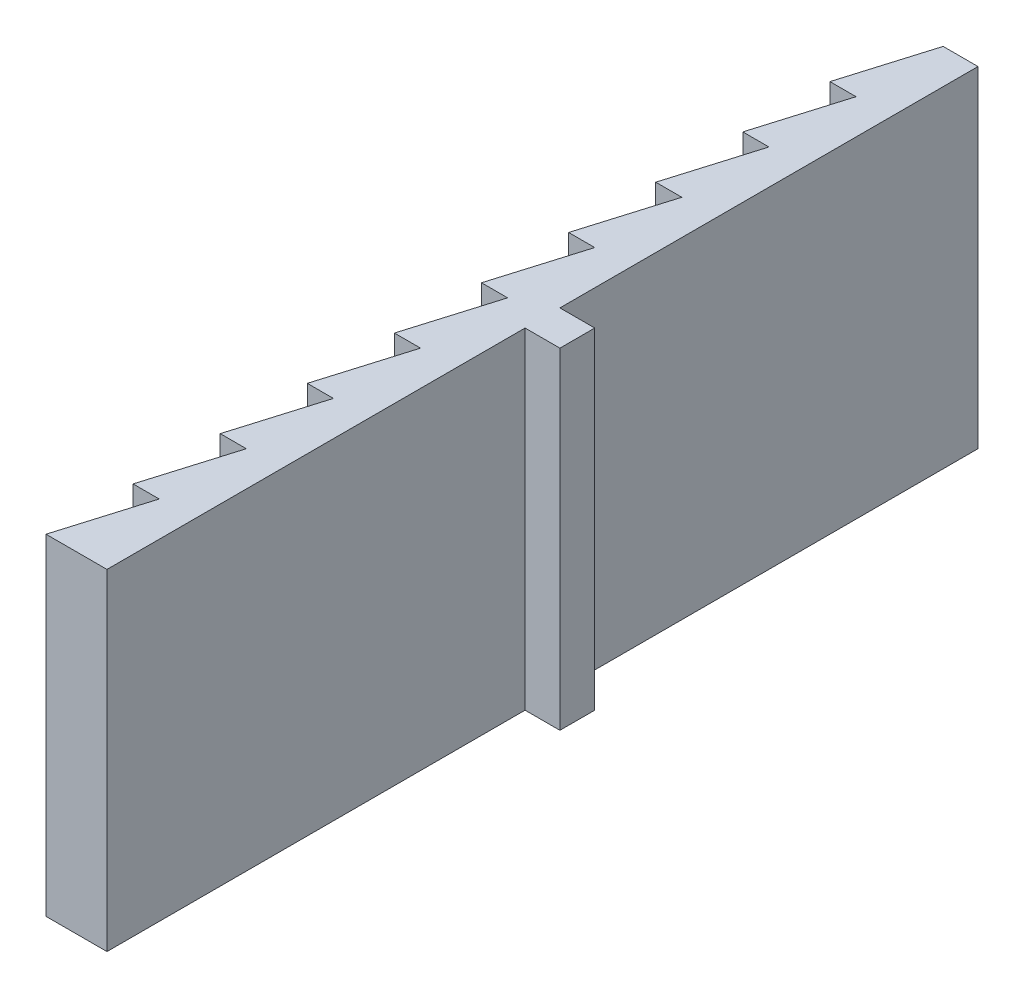
ISO-10303-21;
HEADER;
FILE_DESCRIPTION(('STEP AP214'),'2;1');
FILE_NAME('part.step','',(''),(''),'','','');
FILE_SCHEMA(('AUTOMOTIVE_DESIGN { 1 0 10303 214 1 1 1 1 }'));
ENDSEC;
DATA;
#1=APPLICATION_CONTEXT('core data for automotive mechanical design processes');
#2=APPLICATION_PROTOCOL_DEFINITION('international standard','automotive_design',2000,#1);
#3=PRODUCT_CONTEXT('',#1,'mechanical');
#4=PRODUCT('Part','Part','',(#3));
#5=PRODUCT_RELATED_PRODUCT_CATEGORY('part','',(#4));
#6=PRODUCT_DEFINITION_FORMATION('','',#4);
#7=PRODUCT_DEFINITION_CONTEXT('part definition',#1,'design');
#8=PRODUCT_DEFINITION('design','',#6,#7);
#9=PRODUCT_DEFINITION_SHAPE('','',#8);
#10=(LENGTH_UNIT() NAMED_UNIT(*) SI_UNIT(.MILLI.,.METRE.));
#11=(NAMED_UNIT(*) PLANE_ANGLE_UNIT() SI_UNIT($,.RADIAN.));
#12=(NAMED_UNIT(*) SI_UNIT($,.STERADIAN.) SOLID_ANGLE_UNIT());
#13=UNCERTAINTY_MEASURE_WITH_UNIT(LENGTH_MEASURE(1.E-05),#10,'distance_accuracy_value','');
#14=(GEOMETRIC_REPRESENTATION_CONTEXT(3) GLOBAL_UNCERTAINTY_ASSIGNED_CONTEXT((#13)) GLOBAL_UNIT_ASSIGNED_CONTEXT((#10,
#11,#12)) REPRESENTATION_CONTEXT('',''));
#15=CARTESIAN_POINT('',(0.,0.,0.));
#16=DIRECTION('',(0.,0.,1.));
#17=DIRECTION('',(1.,0.,0.));
#18=AXIS2_PLACEMENT_3D('',#15,#16,#17);
#19=CARTESIAN_POINT('',(0.,9.5,0.));
#20=DIRECTION('',(-1.,0.,0.));
#21=DIRECTION('',(0.,0.,1.));
#22=AXIS2_PLACEMENT_3D('',#19,#20,#21);
#23=PLANE('',#22);
#24=DIRECTION('',(0.,1.,0.));
#25=VECTOR('',#24,1.);
#26=CARTESIAN_POINT('',(0.,0.,-13.));
#27=LINE('',#26,#25);
#28=CARTESIAN_POINT('',(0.,0.,-13.));
#29=VERTEX_POINT('',#28);
#30=CARTESIAN_POINT('',(0.,9.5,-13.));
#31=VERTEX_POINT('',#30);
#32=EDGE_CURVE('E582',#29,#31,#27,.T.);
#33=ORIENTED_EDGE('',*,*,#32,.F.);
#34=DIRECTION('',(0.,0.,-1.));
#35=VECTOR('',#34,1.);
#36=CARTESIAN_POINT('',(0.,0.,0.));
#37=LINE('',#36,#35);
#38=CARTESIAN_POINT('',(0.,0.,-25.));
#39=VERTEX_POINT('',#38);
#40=EDGE_CURVE('E446',#29,#39,#37,.T.);
#41=ORIENTED_EDGE('',*,*,#40,.T.);
#42=DIRECTION('',(0.,-1.,0.));
#43=VECTOR('',#42,1.);
#44=CARTESIAN_POINT('',(0.,9.5,-25.));
#45=LINE('',#44,#43);
#46=CARTESIAN_POINT('',(0.,9.5,-25.));
#47=VERTEX_POINT('',#46);
#48=EDGE_CURVE('E560',#47,#39,#45,.T.);
#49=ORIENTED_EDGE('',*,*,#48,.F.);
#50=DIRECTION('',(0.,0.,-1.));
#51=VECTOR('',#50,1.);
#52=CARTESIAN_POINT('',(0.,9.5,0.));
#53=LINE('',#52,#51);
#54=EDGE_CURVE('E604',#31,#47,#53,.T.);
#55=ORIENTED_EDGE('',*,*,#54,.F.);
#56=EDGE_LOOP('',(#33,#41,#49,#55));
#57=FACE_BOUND('',#56,.T.);
#58=ADVANCED_FACE('F219',(#57),#23,.F.);
#59=CARTESIAN_POINT('',(0.,0.,0.));
#60=DIRECTION('',(0.,1.,0.));
#61=DIRECTION('',(0.,0.,1.));
#62=AXIS2_PLACEMENT_3D('',#59,#60,#61);
#63=PLANE('',#62);
#64=CARTESIAN_POINT('',(0.,0.,0.));
#65=VERTEX_POINT('',#64);
#66=CARTESIAN_POINT('',(0.,0.,-12.));
#67=VERTEX_POINT('',#66);
#68=EDGE_CURVE('E447',#65,#67,#37,.T.);
#69=ORIENTED_EDGE('',*,*,#68,.F.);
#70=DIRECTION('',(1.,0.,0.));
#71=VECTOR('',#70,1.);
#72=CARTESIAN_POINT('',(0.,0.,0.));
#73=LINE('',#72,#71);
#74=CARTESIAN_POINT('',(-1.74999999999977,0.,0.));
#75=VERTEX_POINT('',#74);
#76=EDGE_CURVE('E443',#75,#65,#73,.T.);
#77=ORIENTED_EDGE('',*,*,#76,.F.);
#78=DIRECTION('',(-0.287347885566345,0.,0.957826285221152));
#79=VECTOR('',#78,1.);
#80=CARTESIAN_POINT('',(-1.60550458715575,0.,-0.481651376146724));
#81=LINE('',#80,#79);
#82=CARTESIAN_POINT('',(-1.,0.,-2.5));
#83=VERTEX_POINT('',#82);
#84=EDGE_CURVE('E440',#83,#75,#81,.T.);
#85=ORIENTED_EDGE('',*,*,#84,.F.);
#86=DIRECTION('',(1.,0.,0.));
#87=VECTOR('',#86,1.);
#88=CARTESIAN_POINT('',(-1.74999999999979,0.,-2.5));
#89=LINE('',#88,#87);
#90=CARTESIAN_POINT('',(-1.74999999999979,0.,-2.5));
#91=VERTEX_POINT('',#90);
#92=EDGE_CURVE('E324',#91,#83,#89,.T.);
#93=ORIENTED_EDGE('',*,*,#92,.F.);
#94=DIRECTION('',(-0.287347885566345,0.,0.957826285221151));
#95=VECTOR('',#94,1.);
#96=CARTESIAN_POINT('',(-0.999999999999792,0.,-5.));
#97=LINE('',#96,#95);
#98=CARTESIAN_POINT('',(-1.,0.,-5.));
#99=VERTEX_POINT('',#98);
#100=EDGE_CURVE('E579',#99,#91,#97,.T.);
#101=ORIENTED_EDGE('',*,*,#100,.F.);
#102=DIRECTION('',(1.,0.,0.));
#103=VECTOR('',#102,1.);
#104=CARTESIAN_POINT('',(0.,0.,-5.));
#105=LINE('',#104,#103);
#106=CARTESIAN_POINT('',(-1.74999999999982,0.,-5.));
#107=VERTEX_POINT('',#106);
#108=EDGE_CURVE('E505',#107,#99,#105,.T.);
#109=ORIENTED_EDGE('',*,*,#108,.F.);
#110=DIRECTION('',(-0.287347885566345,0.,0.957826285221152));
#111=VECTOR('',#110,1.);
#112=CARTESIAN_POINT('',(-2.98165137614662,0.,-0.894495412843985));
#113=LINE('',#112,#111);
#114=CARTESIAN_POINT('',(-1.,0.,-7.5));
#115=VERTEX_POINT('',#114);
#116=EDGE_CURVE('E502',#115,#107,#113,.T.);
#117=ORIENTED_EDGE('',*,*,#116,.F.);
#118=DIRECTION('',(1.,0.,0.));
#119=VECTOR('',#118,1.);
#120=CARTESIAN_POINT('',(0.,0.,-7.5));
#121=LINE('',#120,#119);
#122=CARTESIAN_POINT('',(-1.74999999999984,0.,-7.5));
#123=VERTEX_POINT('',#122);
#124=EDGE_CURVE('E409',#123,#115,#121,.T.);
#125=ORIENTED_EDGE('',*,*,#124,.F.);
#126=DIRECTION('',(-0.287347885566345,0.,0.957826285221152));
#127=VECTOR('',#126,1.);
#128=CARTESIAN_POINT('',(-3.66972477064206,0.,-1.10091743119262));
#129=LINE('',#128,#127);
#130=CARTESIAN_POINT('',(-1.,0.,-10.));
#131=VERTEX_POINT('',#130);
#132=EDGE_CURVE('E497',#131,#123,#129,.T.);
#133=ORIENTED_EDGE('',*,*,#132,.F.);
#134=DIRECTION('',(1.,0.,0.));
#135=VECTOR('',#134,1.);
#136=CARTESIAN_POINT('',(0.,0.,-10.));
#137=LINE('',#136,#135);
#138=CARTESIAN_POINT('',(-1.74999999999987,0.,-10.));
#139=VERTEX_POINT('',#138);
#140=EDGE_CURVE('E493',#139,#131,#137,.T.);
#141=ORIENTED_EDGE('',*,*,#140,.F.);
#142=DIRECTION('',(-0.287347885566345,0.,0.957826285221152));
#143=VECTOR('',#142,1.);
#144=CARTESIAN_POINT('',(-4.35779816513749,0.,-1.30733944954125));
#145=LINE('',#144,#143);
#146=CARTESIAN_POINT('',(-1.,0.,-12.5));
#147=VERTEX_POINT('',#146);
#148=EDGE_CURVE('E490',#147,#139,#145,.T.);
#149=ORIENTED_EDGE('',*,*,#148,.F.);
#150=DIRECTION('',(1.,0.,0.));
#151=VECTOR('',#150,1.);
#152=CARTESIAN_POINT('',(0.,0.,-12.5));
#153=LINE('',#152,#151);
#154=CARTESIAN_POINT('',(-1.7499999999999,0.,-12.5));
#155=VERTEX_POINT('',#154);
#156=EDGE_CURVE('E486',#155,#147,#153,.T.);
#157=ORIENTED_EDGE('',*,*,#156,.F.);
#158=DIRECTION('',(-0.287347885566345,0.,0.957826285221152));
#159=VECTOR('',#158,1.);
#160=CARTESIAN_POINT('',(-5.04587155963293,0.,-1.51376146788988));
#161=LINE('',#160,#159);
#162=CARTESIAN_POINT('',(-1.,0.,-15.));
#163=VERTEX_POINT('',#162);
#164=EDGE_CURVE('E483',#163,#155,#161,.T.);
#165=ORIENTED_EDGE('',*,*,#164,.F.);
#166=DIRECTION('',(1.,0.,0.));
#167=VECTOR('',#166,1.);
#168=CARTESIAN_POINT('',(0.,0.,-15.));
#169=LINE('',#168,#167);
#170=CARTESIAN_POINT('',(-1.74999999999992,0.,-15.));
#171=VERTEX_POINT('',#170);
#172=EDGE_CURVE('E479',#171,#163,#169,.T.);
#173=ORIENTED_EDGE('',*,*,#172,.F.);
#174=DIRECTION('',(-0.287347885566345,0.,0.957826285221152));
#175=VECTOR('',#174,1.);
#176=CARTESIAN_POINT('',(-5.73394495412836,0.,-1.72018348623851));
#177=LINE('',#176,#175);
#178=CARTESIAN_POINT('',(-1.,0.,-17.5));
#179=VERTEX_POINT('',#178);
#180=EDGE_CURVE('E476',#179,#171,#177,.T.);
#181=ORIENTED_EDGE('',*,*,#180,.F.);
#182=DIRECTION('',(1.,0.,0.));
#183=VECTOR('',#182,1.);
#184=CARTESIAN_POINT('',(0.,0.,-17.5));
#185=LINE('',#184,#183);
#186=CARTESIAN_POINT('',(-1.74999999999995,0.,-17.5));
#187=VERTEX_POINT('',#186);
#188=EDGE_CURVE('E472',#187,#179,#185,.T.);
#189=ORIENTED_EDGE('',*,*,#188,.F.);
#190=DIRECTION('',(-0.287347885566345,0.,0.957826285221152));
#191=VECTOR('',#190,1.);
#192=CARTESIAN_POINT('',(-6.4220183486238,0.,-1.92660550458714));
#193=LINE('',#192,#191);
#194=CARTESIAN_POINT('',(-1.,0.,-20.));
#195=VERTEX_POINT('',#194);
#196=EDGE_CURVE('E469',#195,#187,#193,.T.);
#197=ORIENTED_EDGE('',*,*,#196,.F.);
#198=DIRECTION('',(1.,0.,0.));
#199=VECTOR('',#198,1.);
#200=CARTESIAN_POINT('',(0.,0.,-20.));
#201=LINE('',#200,#199);
#202=CARTESIAN_POINT('',(-1.74999999999997,0.,-20.));
#203=VERTEX_POINT('',#202);
#204=EDGE_CURVE('E465',#203,#195,#201,.T.);
#205=ORIENTED_EDGE('',*,*,#204,.F.);
#206=DIRECTION('',(-0.287347885566345,0.,0.957826285221152));
#207=VECTOR('',#206,1.);
#208=CARTESIAN_POINT('',(-7.11009174311924,0.,-2.13302752293577));
#209=LINE('',#208,#207);
#210=CARTESIAN_POINT('',(-1.,0.,-22.5));
#211=VERTEX_POINT('',#210);
#212=EDGE_CURVE('E462',#211,#203,#209,.T.);
#213=ORIENTED_EDGE('',*,*,#212,.F.);
#214=DIRECTION('',(1.,0.,0.));
#215=VECTOR('',#214,1.);
#216=CARTESIAN_POINT('',(0.,0.,-22.5));
#217=LINE('',#216,#215);
#218=CARTESIAN_POINT('',(-1.75,0.,-22.5));
#219=VERTEX_POINT('',#218);
#220=EDGE_CURVE('E458',#219,#211,#217,.T.);
#221=ORIENTED_EDGE('',*,*,#220,.F.);
#222=DIRECTION('',(-0.287347885566345,0.,0.957826285221152));
#223=VECTOR('',#222,1.);
#224=CARTESIAN_POINT('',(-7.79816513761467,0.,-2.3394495412844));
#225=LINE('',#224,#223);
#226=CARTESIAN_POINT('',(-1.,0.,-25.));
#227=VERTEX_POINT('',#226);
#228=EDGE_CURVE('E455',#227,#219,#225,.T.);
#229=ORIENTED_EDGE('',*,*,#228,.F.);
#230=DIRECTION('',(-1.,0.,0.));
#231=VECTOR('',#230,1.);
#232=CARTESIAN_POINT('',(0.,0.,-25.));
#233=LINE('',#232,#231);
#234=EDGE_CURVE('E451',#39,#227,#233,.T.);
#235=ORIENTED_EDGE('',*,*,#234,.F.);
#236=ORIENTED_EDGE('',*,*,#40,.F.);
#237=DIRECTION('',(-1.,0.,0.));
#238=VECTOR('',#237,1.);
#239=CARTESIAN_POINT('',(0.,0.,-13.));
#240=LINE('',#239,#238);
#241=CARTESIAN_POINT('',(1.,0.,-13.));
#242=VERTEX_POINT('',#241);
#243=EDGE_CURVE('E333',#242,#29,#240,.T.);
#244=ORIENTED_EDGE('',*,*,#243,.F.);
#245=DIRECTION('',(0.,0.,-1.));
#246=VECTOR('',#245,1.);
#247=CARTESIAN_POINT('',(1.,0.,-13.));
#248=LINE('',#247,#246);
#249=CARTESIAN_POINT('',(1.,0.,-12.));
#250=VERTEX_POINT('',#249);
#251=EDGE_CURVE('E692',#250,#242,#248,.T.);
#252=ORIENTED_EDGE('',*,*,#251,.F.);
#253=DIRECTION('',(1.,0.,0.));
#254=VECTOR('',#253,1.);
#255=CARTESIAN_POINT('',(0.,0.,-12.));
#256=LINE('',#255,#254);
#257=EDGE_CURVE('E697',#67,#250,#256,.T.);
#258=ORIENTED_EDGE('',*,*,#257,.F.);
#259=EDGE_LOOP('',(#69,#77,#85,#93,#101,#109,#117,#125,#133,#141,#149,#157,#165,#173,#181,#189,
#197,#205,#213,#221,#229,#235,#236,#244,#252,#258));
#260=FACE_BOUND('',#259,.T.);
#261=ADVANCED_FACE('F591',(#260),#63,.F.);
#262=CARTESIAN_POINT('',(0.,9.5,0.));
#263=DIRECTION('',(0.,0.,-1.));
#264=DIRECTION('',(-1.,0.,0.));
#265=AXIS2_PLACEMENT_3D('',#262,#263,#264);
#266=PLANE('',#265);
#267=DIRECTION('',(0.,-1.,0.));
#268=VECTOR('',#267,1.);
#269=CARTESIAN_POINT('',(0.,9.5,0.));
#270=LINE('',#269,#268);
#271=CARTESIAN_POINT('',(0.,9.5,0.));
#272=VERTEX_POINT('',#271);
#273=EDGE_CURVE('E564',#272,#65,#270,.T.);
#274=ORIENTED_EDGE('',*,*,#273,.F.);
#275=DIRECTION('',(1.,0.,0.));
#276=VECTOR('',#275,1.);
#277=CARTESIAN_POINT('',(0.,9.5,0.));
#278=LINE('',#277,#276);
#279=CARTESIAN_POINT('',(-1.74999999999977,9.5,0.));
#280=VERTEX_POINT('',#279);
#281=EDGE_CURVE('E600',#280,#272,#278,.T.);
#282=ORIENTED_EDGE('',*,*,#281,.F.);
#283=DIRECTION('',(0.,-1.,0.));
#284=VECTOR('',#283,1.);
#285=CARTESIAN_POINT('',(-1.74999999999977,9.5,0.));
#286=LINE('',#285,#284);
#287=EDGE_CURVE('E229',#280,#75,#286,.T.);
#288=ORIENTED_EDGE('',*,*,#287,.T.);
#289=ORIENTED_EDGE('',*,*,#76,.T.);
#290=EDGE_LOOP('',(#274,#282,#288,#289));
#291=FACE_BOUND('',#290,.T.);
#292=ADVANCED_FACE('F599',(#291),#266,.F.);
#293=ORIENTED_EDGE('',*,*,#68,.T.);
#294=DIRECTION('',(0.,1.,0.));
#295=VECTOR('',#294,1.);
#296=CARTESIAN_POINT('',(0.,0.,-12.));
#297=LINE('',#296,#295);
#298=CARTESIAN_POINT('',(0.,9.5,-12.));
#299=VERTEX_POINT('',#298);
#300=EDGE_CURVE('E687',#67,#299,#297,.T.);
#301=ORIENTED_EDGE('',*,*,#300,.T.);
#302=EDGE_CURVE('E608',#272,#299,#53,.T.);
#303=ORIENTED_EDGE('',*,*,#302,.F.);
#304=ORIENTED_EDGE('',*,*,#273,.T.);
#305=EDGE_LOOP('',(#293,#301,#303,#304));
#306=FACE_BOUND('',#305,.T.);
#307=ADVANCED_FACE('F841',(#306),#23,.F.);
#308=CARTESIAN_POINT('',(0.,9.5,-25.));
#309=DIRECTION('',(0.,0.,1.));
#310=DIRECTION('',(1.,0.,0.));
#311=AXIS2_PLACEMENT_3D('',#308,#309,#310);
#312=PLANE('',#311);
#313=ORIENTED_EDGE('',*,*,#234,.T.);
#314=DIRECTION('',(0.,-1.,0.));
#315=VECTOR('',#314,1.);
#316=CARTESIAN_POINT('',(-1.,9.5,-25.));
#317=LINE('',#316,#315);
#318=CARTESIAN_POINT('',(-1.,9.5,-25.));
#319=VERTEX_POINT('',#318);
#320=EDGE_CURVE('E557',#319,#227,#317,.T.);
#321=ORIENTED_EDGE('',*,*,#320,.F.);
#322=DIRECTION('',(-1.,0.,0.));
#323=VECTOR('',#322,1.);
#324=CARTESIAN_POINT('',(0.,9.5,-25.));
#325=LINE('',#324,#323);
#326=EDGE_CURVE('E615',#47,#319,#325,.T.);
#327=ORIENTED_EDGE('',*,*,#326,.F.);
#328=ORIENTED_EDGE('',*,*,#48,.T.);
#329=EDGE_LOOP('',(#313,#321,#327,#328));
#330=FACE_BOUND('',#329,.T.);
#331=ADVANCED_FACE('F771',(#330),#312,.F.);
#332=CARTESIAN_POINT('',(0.,9.5,0.));
#333=DIRECTION('',(0.,1.,0.));
#334=DIRECTION('',(0.,0.,1.));
#335=AXIS2_PLACEMENT_3D('',#332,#333,#334);
#336=PLANE('',#335);
#337=DIRECTION('',(1.,0.,0.));
#338=VECTOR('',#337,1.);
#339=CARTESIAN_POINT('',(0.,9.5,-5.));
#340=LINE('',#339,#338);
#341=CARTESIAN_POINT('',(-1.74999999999982,9.5,-5.));
#342=VERTEX_POINT('',#341);
#343=CARTESIAN_POINT('',(-1.,9.5,-5.));
#344=VERTEX_POINT('',#343);
#345=EDGE_CURVE('E431',#342,#344,#340,.T.);
#346=ORIENTED_EDGE('',*,*,#345,.T.);
#347=DIRECTION('',(-0.287347885566345,0.,0.957826285221151));
#348=VECTOR('',#347,1.);
#349=CARTESIAN_POINT('',(-0.999999999999792,9.5,-5.));
#350=LINE('',#349,#348);
#351=CARTESIAN_POINT('',(-1.74999999999979,9.5,-2.5));
#352=VERTEX_POINT('',#351);
#353=EDGE_CURVE('E571',#344,#352,#350,.T.);
#354=ORIENTED_EDGE('',*,*,#353,.T.);
#355=DIRECTION('',(1.,0.,0.));
#356=VECTOR('',#355,1.);
#357=CARTESIAN_POINT('',(-1.74999999999979,9.5,-2.5));
#358=LINE('',#357,#356);
#359=CARTESIAN_POINT('',(-1.,9.5,-2.5));
#360=VERTEX_POINT('',#359);
#361=EDGE_CURVE('E575',#352,#360,#358,.T.);
#362=ORIENTED_EDGE('',*,*,#361,.T.);
#363=DIRECTION('',(-0.287347885566345,0.,0.957826285221152));
#364=VECTOR('',#363,1.);
#365=CARTESIAN_POINT('',(-1.60550458715575,9.5,-0.481651376146724));
#366=LINE('',#365,#364);
#367=EDGE_CURVE('E508',#360,#280,#366,.T.);
#368=ORIENTED_EDGE('',*,*,#367,.T.);
#369=ORIENTED_EDGE('',*,*,#281,.T.);
#370=ORIENTED_EDGE('',*,*,#302,.T.);
#371=DIRECTION('',(1.,0.,0.));
#372=VECTOR('',#371,1.);
#373=CARTESIAN_POINT('',(0.,9.5,-12.));
#374=LINE('',#373,#372);
#375=CARTESIAN_POINT('',(1.,9.5,-12.));
#376=VERTEX_POINT('',#375);
#377=EDGE_CURVE('E237',#299,#376,#374,.T.);
#378=ORIENTED_EDGE('',*,*,#377,.T.);
#379=DIRECTION('',(0.,0.,-1.));
#380=VECTOR('',#379,1.);
#381=CARTESIAN_POINT('',(1.,9.5,-13.));
#382=LINE('',#381,#380);
#383=CARTESIAN_POINT('',(1.,9.5,-13.));
#384=VERTEX_POINT('',#383);
#385=EDGE_CURVE('E706',#376,#384,#382,.T.);
#386=ORIENTED_EDGE('',*,*,#385,.T.);
#387=DIRECTION('',(-1.,0.,0.));
#388=VECTOR('',#387,1.);
#389=CARTESIAN_POINT('',(0.,9.5,-13.));
#390=LINE('',#389,#388);
#391=EDGE_CURVE('E702',#384,#31,#390,.T.);
#392=ORIENTED_EDGE('',*,*,#391,.T.);
#393=ORIENTED_EDGE('',*,*,#54,.T.);
#394=ORIENTED_EDGE('',*,*,#326,.T.);
#395=DIRECTION('',(-0.287347885566345,0.,0.957826285221152));
#396=VECTOR('',#395,1.);
#397=CARTESIAN_POINT('',(-7.79816513761467,9.5,-2.3394495412844));
#398=LINE('',#397,#396);
#399=CARTESIAN_POINT('',(-1.75,9.5,-22.5));
#400=VERTEX_POINT('',#399);
#401=EDGE_CURVE('E619',#319,#400,#398,.T.);
#402=ORIENTED_EDGE('',*,*,#401,.T.);
#403=DIRECTION('',(1.,0.,0.));
#404=VECTOR('',#403,1.);
#405=CARTESIAN_POINT('',(0.,9.5,-22.5));
#406=LINE('',#405,#404);
#407=CARTESIAN_POINT('',(-1.,9.5,-22.5));
#408=VERTEX_POINT('',#407);
#409=EDGE_CURVE('E622',#400,#408,#406,.T.);
#410=ORIENTED_EDGE('',*,*,#409,.T.);
#411=DIRECTION('',(-0.287347885566345,0.,0.957826285221152));
#412=VECTOR('',#411,1.);
#413=CARTESIAN_POINT('',(-7.11009174311924,9.5,-2.13302752293577));
#414=LINE('',#413,#412);
#415=CARTESIAN_POINT('',(-1.74999999999997,9.5,-20.));
#416=VERTEX_POINT('',#415);
#417=EDGE_CURVE('E626',#408,#416,#414,.T.);
#418=ORIENTED_EDGE('',*,*,#417,.T.);
#419=DIRECTION('',(1.,0.,0.));
#420=VECTOR('',#419,1.);
#421=CARTESIAN_POINT('',(0.,9.5,-20.));
#422=LINE('',#421,#420);
#423=CARTESIAN_POINT('',(-1.,9.5,-20.));
#424=VERTEX_POINT('',#423);
#425=EDGE_CURVE('E629',#416,#424,#422,.T.);
#426=ORIENTED_EDGE('',*,*,#425,.T.);
#427=DIRECTION('',(-0.287347885566345,0.,0.957826285221152));
#428=VECTOR('',#427,1.);
#429=CARTESIAN_POINT('',(-6.4220183486238,9.5,-1.92660550458714));
#430=LINE('',#429,#428);
#431=CARTESIAN_POINT('',(-1.74999999999995,9.5,-17.5));
#432=VERTEX_POINT('',#431);
#433=EDGE_CURVE('E633',#424,#432,#430,.T.);
#434=ORIENTED_EDGE('',*,*,#433,.T.);
#435=DIRECTION('',(1.,0.,0.));
#436=VECTOR('',#435,1.);
#437=CARTESIAN_POINT('',(0.,9.5,-17.5));
#438=LINE('',#437,#436);
#439=CARTESIAN_POINT('',(-1.,9.5,-17.5));
#440=VERTEX_POINT('',#439);
#441=EDGE_CURVE('E636',#432,#440,#438,.T.);
#442=ORIENTED_EDGE('',*,*,#441,.T.);
#443=DIRECTION('',(-0.287347885566345,0.,0.957826285221152));
#444=VECTOR('',#443,1.);
#445=CARTESIAN_POINT('',(-5.73394495412836,9.5,-1.72018348623851));
#446=LINE('',#445,#444);
#447=CARTESIAN_POINT('',(-1.74999999999992,9.5,-15.));
#448=VERTEX_POINT('',#447);
#449=EDGE_CURVE('E640',#440,#448,#446,.T.);
#450=ORIENTED_EDGE('',*,*,#449,.T.);
#451=DIRECTION('',(1.,0.,0.));
#452=VECTOR('',#451,1.);
#453=CARTESIAN_POINT('',(0.,9.5,-15.));
#454=LINE('',#453,#452);
#455=CARTESIAN_POINT('',(-1.,9.5,-15.));
#456=VERTEX_POINT('',#455);
#457=EDGE_CURVE('E643',#448,#456,#454,.T.);
#458=ORIENTED_EDGE('',*,*,#457,.T.);
#459=DIRECTION('',(-0.287347885566345,0.,0.957826285221152));
#460=VECTOR('',#459,1.);
#461=CARTESIAN_POINT('',(-5.04587155963293,9.5,-1.51376146788988));
#462=LINE('',#461,#460);
#463=CARTESIAN_POINT('',(-1.7499999999999,9.5,-12.5));
#464=VERTEX_POINT('',#463);
#465=EDGE_CURVE('E646',#456,#464,#462,.T.);
#466=ORIENTED_EDGE('',*,*,#465,.T.);
#467=DIRECTION('',(1.,0.,0.));
#468=VECTOR('',#467,1.);
#469=CARTESIAN_POINT('',(0.,9.5,-12.5));
#470=LINE('',#469,#468);
#471=CARTESIAN_POINT('',(-1.,9.5,-12.5));
#472=VERTEX_POINT('',#471);
#473=EDGE_CURVE('E649',#464,#472,#470,.T.);
#474=ORIENTED_EDGE('',*,*,#473,.T.);
#475=DIRECTION('',(-0.287347885566345,0.,0.957826285221152));
#476=VECTOR('',#475,1.);
#477=CARTESIAN_POINT('',(-4.35779816513749,9.5,-1.30733944954125));
#478=LINE('',#477,#476);
#479=CARTESIAN_POINT('',(-1.74999999999987,9.5,-10.));
#480=VERTEX_POINT('',#479);
#481=EDGE_CURVE('E653',#472,#480,#478,.T.);
#482=ORIENTED_EDGE('',*,*,#481,.T.);
#483=DIRECTION('',(1.,0.,0.));
#484=VECTOR('',#483,1.);
#485=CARTESIAN_POINT('',(0.,9.5,-10.));
#486=LINE('',#485,#484);
#487=CARTESIAN_POINT('',(-1.,9.5,-10.));
#488=VERTEX_POINT('',#487);
#489=EDGE_CURVE('E656',#480,#488,#486,.T.);
#490=ORIENTED_EDGE('',*,*,#489,.T.);
#491=DIRECTION('',(-0.287347885566345,0.,0.957826285221152));
#492=VECTOR('',#491,1.);
#493=CARTESIAN_POINT('',(-3.66972477064206,9.5,-1.10091743119262));
#494=LINE('',#493,#492);
#495=CARTESIAN_POINT('',(-1.74999999999984,9.5,-7.5));
#496=VERTEX_POINT('',#495);
#497=EDGE_CURVE('E424',#488,#496,#494,.T.);
#498=ORIENTED_EDGE('',*,*,#497,.T.);
#499=DIRECTION('',(1.,0.,0.));
#500=VECTOR('',#499,1.);
#501=CARTESIAN_POINT('',(0.,9.5,-7.5));
#502=LINE('',#501,#500);
#503=CARTESIAN_POINT('',(-1.,9.5,-7.5));
#504=VERTEX_POINT('',#503);
#505=EDGE_CURVE('E407',#496,#504,#502,.T.);
#506=ORIENTED_EDGE('',*,*,#505,.T.);
#507=DIRECTION('',(-0.287347885566345,0.,0.957826285221152));
#508=VECTOR('',#507,1.);
#509=CARTESIAN_POINT('',(-2.98165137614662,9.5,-0.894495412843985));
#510=LINE('',#509,#508);
#511=EDGE_CURVE('E420',#504,#342,#510,.T.);
#512=ORIENTED_EDGE('',*,*,#511,.T.);
#513=EDGE_LOOP('',(#346,#354,#362,#368,#369,#370,#378,#386,#392,#393,#394,#402,#410,#418,#426,
#434,#442,#450,#458,#466,#474,#482,#490,#498,#506,#512));
#514=FACE_BOUND('',#513,.T.);
#515=ADVANCED_FACE('F419',(#514),#336,.T.);
#516=CARTESIAN_POINT('',(-1.74999999999979,9.5,-2.5));
#517=DIRECTION('',(0.,0.,-1.));
#518=DIRECTION('',(-1.,0.,0.));
#519=AXIS2_PLACEMENT_3D('',#516,#517,#518);
#520=PLANE('',#519);
#521=ORIENTED_EDGE('',*,*,#92,.T.);
#522=DIRECTION('',(0.,-1.,0.));
#523=VECTOR('',#522,1.);
#524=CARTESIAN_POINT('',(-1.,9.5,-2.5));
#525=LINE('',#524,#523);
#526=EDGE_CURVE('E12',#360,#83,#525,.T.);
#527=ORIENTED_EDGE('',*,*,#526,.F.);
#528=ORIENTED_EDGE('',*,*,#361,.F.);
#529=DIRECTION('',(0.,-1.,0.));
#530=VECTOR('',#529,1.);
#531=CARTESIAN_POINT('',(-1.74999999999979,9.5,-2.5));
#532=LINE('',#531,#530);
#533=EDGE_CURVE('E223',#352,#91,#532,.T.);
#534=ORIENTED_EDGE('',*,*,#533,.T.);
#535=EDGE_LOOP('',(#521,#527,#528,#534));
#536=FACE_BOUND('',#535,.T.);
#537=ADVANCED_FACE('F587',(#536),#520,.F.);
#538=CARTESIAN_POINT('',(-0.999999999999792,9.5,-5.));
#539=DIRECTION('',(0.957826285221151,0.,0.287347885566345));
#540=DIRECTION('',(0.287347885566345,0.,-0.957826285221152));
#541=AXIS2_PLACEMENT_3D('',#538,#539,#540);
#542=PLANE('',#541);
#543=ORIENTED_EDGE('',*,*,#100,.T.);
#544=ORIENTED_EDGE('',*,*,#533,.F.);
#545=ORIENTED_EDGE('',*,*,#353,.F.);
#546=DIRECTION('',(0.,-1.,0.));
#547=VECTOR('',#546,1.);
#548=CARTESIAN_POINT('',(-1.,9.5,-5.));
#549=LINE('',#548,#547);
#550=EDGE_CURVE('E246',#344,#99,#549,.T.);
#551=ORIENTED_EDGE('',*,*,#550,.T.);
#552=EDGE_LOOP('',(#543,#544,#545,#551));
#553=FACE_BOUND('',#552,.T.);
#554=ADVANCED_FACE('F221',(#553),#542,.F.);
#555=CARTESIAN_POINT('',(-7.79816513761467,9.5,-2.3394495412844));
#556=DIRECTION('',(0.957826285221151,0.,0.287347885566345));
#557=DIRECTION('',(0.287347885566345,0.,-0.957826285221152));
#558=AXIS2_PLACEMENT_3D('',#555,#556,#557);
#559=PLANE('',#558);
#560=ORIENTED_EDGE('',*,*,#228,.T.);
#561=DIRECTION('',(0.,-1.,0.));
#562=VECTOR('',#561,1.);
#563=CARTESIAN_POINT('',(-1.75,9.5,-22.5));
#564=LINE('',#563,#562);
#565=EDGE_CURVE('E553',#400,#219,#564,.T.);
#566=ORIENTED_EDGE('',*,*,#565,.F.);
#567=ORIENTED_EDGE('',*,*,#401,.F.);
#568=ORIENTED_EDGE('',*,*,#320,.T.);
#569=EDGE_LOOP('',(#560,#566,#567,#568));
#570=FACE_BOUND('',#569,.T.);
#571=ADVANCED_FACE('F777',(#570),#559,.F.);
#572=CARTESIAN_POINT('',(0.,9.5,-22.5));
#573=DIRECTION('',(0.,0.,-1.));
#574=DIRECTION('',(-1.,0.,0.));
#575=AXIS2_PLACEMENT_3D('',#572,#573,#574);
#576=PLANE('',#575);
#577=ORIENTED_EDGE('',*,*,#220,.T.);
#578=DIRECTION('',(0.,-1.,0.));
#579=VECTOR('',#578,1.);
#580=CARTESIAN_POINT('',(-1.,9.5,-22.5));
#581=LINE('',#580,#579);
#582=EDGE_CURVE('E550',#408,#211,#581,.T.);
#583=ORIENTED_EDGE('',*,*,#582,.F.);
#584=ORIENTED_EDGE('',*,*,#409,.F.);
#585=ORIENTED_EDGE('',*,*,#565,.T.);
#586=EDGE_LOOP('',(#577,#583,#584,#585));
#587=FACE_BOUND('',#586,.T.);
#588=ADVANCED_FACE('F781',(#587),#576,.F.);
#589=CARTESIAN_POINT('',(-7.11009174311924,9.5,-2.13302752293577));
#590=DIRECTION('',(0.957826285221151,0.,0.287347885566345));
#591=DIRECTION('',(0.287347885566345,0.,-0.957826285221152));
#592=AXIS2_PLACEMENT_3D('',#589,#590,#591);
#593=PLANE('',#592);
#594=ORIENTED_EDGE('',*,*,#212,.T.);
#595=DIRECTION('',(0.,-1.,0.));
#596=VECTOR('',#595,1.);
#597=CARTESIAN_POINT('',(-1.74999999999997,9.5,-20.));
#598=LINE('',#597,#596);
#599=EDGE_CURVE('E546',#416,#203,#598,.T.);
#600=ORIENTED_EDGE('',*,*,#599,.F.);
#601=ORIENTED_EDGE('',*,*,#417,.F.);
#602=ORIENTED_EDGE('',*,*,#582,.T.);
#603=EDGE_LOOP('',(#594,#600,#601,#602));
#604=FACE_BOUND('',#603,.T.);
#605=ADVANCED_FACE('F785',(#604),#593,.F.);
#606=CARTESIAN_POINT('',(0.,9.5,-20.));
#607=DIRECTION('',(0.,0.,-1.));
#608=DIRECTION('',(-1.,0.,0.));
#609=AXIS2_PLACEMENT_3D('',#606,#607,#608);
#610=PLANE('',#609);
#611=ORIENTED_EDGE('',*,*,#204,.T.);
#612=DIRECTION('',(0.,-1.,0.));
#613=VECTOR('',#612,1.);
#614=CARTESIAN_POINT('',(-1.,9.5,-20.));
#615=LINE('',#614,#613);
#616=EDGE_CURVE('E543',#424,#195,#615,.T.);
#617=ORIENTED_EDGE('',*,*,#616,.F.);
#618=ORIENTED_EDGE('',*,*,#425,.F.);
#619=ORIENTED_EDGE('',*,*,#599,.T.);
#620=EDGE_LOOP('',(#611,#617,#618,#619));
#621=FACE_BOUND('',#620,.T.);
#622=ADVANCED_FACE('F789',(#621),#610,.F.);
#623=CARTESIAN_POINT('',(-6.4220183486238,9.5,-1.92660550458714));
#624=DIRECTION('',(0.957826285221151,0.,0.287347885566345));
#625=DIRECTION('',(0.287347885566345,0.,-0.957826285221152));
#626=AXIS2_PLACEMENT_3D('',#623,#624,#625);
#627=PLANE('',#626);
#628=ORIENTED_EDGE('',*,*,#196,.T.);
#629=DIRECTION('',(0.,-1.,0.));
#630=VECTOR('',#629,1.);
#631=CARTESIAN_POINT('',(-1.74999999999995,9.5,-17.5));
#632=LINE('',#631,#630);
#633=EDGE_CURVE('E539',#432,#187,#632,.T.);
#634=ORIENTED_EDGE('',*,*,#633,.F.);
#635=ORIENTED_EDGE('',*,*,#433,.F.);
#636=ORIENTED_EDGE('',*,*,#616,.T.);
#637=EDGE_LOOP('',(#628,#634,#635,#636));
#638=FACE_BOUND('',#637,.T.);
#639=ADVANCED_FACE('F793',(#638),#627,.F.);
#640=CARTESIAN_POINT('',(0.,9.5,-17.5));
#641=DIRECTION('',(0.,0.,-1.));
#642=DIRECTION('',(-1.,0.,0.));
#643=AXIS2_PLACEMENT_3D('',#640,#641,#642);
#644=PLANE('',#643);
#645=ORIENTED_EDGE('',*,*,#188,.T.);
#646=DIRECTION('',(0.,-1.,0.));
#647=VECTOR('',#646,1.);
#648=CARTESIAN_POINT('',(-1.,9.5,-17.5));
#649=LINE('',#648,#647);
#650=EDGE_CURVE('E536',#440,#179,#649,.T.);
#651=ORIENTED_EDGE('',*,*,#650,.F.);
#652=ORIENTED_EDGE('',*,*,#441,.F.);
#653=ORIENTED_EDGE('',*,*,#633,.T.);
#654=EDGE_LOOP('',(#645,#651,#652,#653));
#655=FACE_BOUND('',#654,.T.);
#656=ADVANCED_FACE('F798',(#655),#644,.F.);
#657=CARTESIAN_POINT('',(-5.73394495412836,9.5,-1.72018348623851));
#658=DIRECTION('',(0.957826285221151,0.,0.287347885566345));
#659=DIRECTION('',(0.287347885566345,0.,-0.957826285221152));
#660=AXIS2_PLACEMENT_3D('',#657,#658,#659);
#661=PLANE('',#660);
#662=ORIENTED_EDGE('',*,*,#180,.T.);
#663=DIRECTION('',(0.,-1.,0.));
#664=VECTOR('',#663,1.);
#665=CARTESIAN_POINT('',(-1.74999999999992,9.5,-15.));
#666=LINE('',#665,#664);
#667=EDGE_CURVE('E532',#448,#171,#666,.T.);
#668=ORIENTED_EDGE('',*,*,#667,.F.);
#669=ORIENTED_EDGE('',*,*,#449,.F.);
#670=ORIENTED_EDGE('',*,*,#650,.T.);
#671=EDGE_LOOP('',(#662,#668,#669,#670));
#672=FACE_BOUND('',#671,.T.);
#673=ADVANCED_FACE('F802',(#672),#661,.F.);
#674=CARTESIAN_POINT('',(0.,9.5,-15.));
#675=DIRECTION('',(0.,0.,-1.));
#676=DIRECTION('',(-1.,0.,0.));
#677=AXIS2_PLACEMENT_3D('',#674,#675,#676);
#678=PLANE('',#677);
#679=ORIENTED_EDGE('',*,*,#172,.T.);
#680=DIRECTION('',(0.,-1.,0.));
#681=VECTOR('',#680,1.);
#682=CARTESIAN_POINT('',(-1.,9.5,-15.));
#683=LINE('',#682,#681);
#684=EDGE_CURVE('E529',#456,#163,#683,.T.);
#685=ORIENTED_EDGE('',*,*,#684,.F.);
#686=ORIENTED_EDGE('',*,*,#457,.F.);
#687=ORIENTED_EDGE('',*,*,#667,.T.);
#688=EDGE_LOOP('',(#679,#685,#686,#687));
#689=FACE_BOUND('',#688,.T.);
#690=ADVANCED_FACE('F807',(#689),#678,.F.);
#691=CARTESIAN_POINT('',(-5.04587155963293,9.5,-1.51376146788988));
#692=DIRECTION('',(0.957826285221151,0.,0.287347885566345));
#693=DIRECTION('',(0.287347885566345,0.,-0.957826285221152));
#694=AXIS2_PLACEMENT_3D('',#691,#692,#693);
#695=PLANE('',#694);
#696=ORIENTED_EDGE('',*,*,#164,.T.);
#697=DIRECTION('',(0.,-1.,0.));
#698=VECTOR('',#697,1.);
#699=CARTESIAN_POINT('',(-1.7499999999999,9.5,-12.5));
#700=LINE('',#699,#698);
#701=EDGE_CURVE('E525',#464,#155,#700,.T.);
#702=ORIENTED_EDGE('',*,*,#701,.F.);
#703=ORIENTED_EDGE('',*,*,#465,.F.);
#704=ORIENTED_EDGE('',*,*,#684,.T.);
#705=EDGE_LOOP('',(#696,#702,#703,#704));
#706=FACE_BOUND('',#705,.T.);
#707=ADVANCED_FACE('F811',(#706),#695,.F.);
#708=CARTESIAN_POINT('',(0.,9.5,-12.5));
#709=DIRECTION('',(0.,0.,-1.));
#710=DIRECTION('',(-1.,0.,0.));
#711=AXIS2_PLACEMENT_3D('',#708,#709,#710);
#712=PLANE('',#711);
#713=ORIENTED_EDGE('',*,*,#156,.T.);
#714=DIRECTION('',(0.,-1.,0.));
#715=VECTOR('',#714,1.);
#716=CARTESIAN_POINT('',(-1.,9.5,-12.5));
#717=LINE('',#716,#715);
#718=EDGE_CURVE('E522',#472,#147,#717,.T.);
#719=ORIENTED_EDGE('',*,*,#718,.F.);
#720=ORIENTED_EDGE('',*,*,#473,.F.);
#721=ORIENTED_EDGE('',*,*,#701,.T.);
#722=EDGE_LOOP('',(#713,#719,#720,#721));
#723=FACE_BOUND('',#722,.T.);
#724=ADVANCED_FACE('F816',(#723),#712,.F.);
#725=CARTESIAN_POINT('',(-4.35779816513749,9.5,-1.30733944954125));
#726=DIRECTION('',(0.957826285221151,0.,0.287347885566345));
#727=DIRECTION('',(0.287347885566345,0.,-0.957826285221152));
#728=AXIS2_PLACEMENT_3D('',#725,#726,#727);
#729=PLANE('',#728);
#730=ORIENTED_EDGE('',*,*,#148,.T.);
#731=DIRECTION('',(0.,-1.,0.));
#732=VECTOR('',#731,1.);
#733=CARTESIAN_POINT('',(-1.74999999999987,9.5,-10.));
#734=LINE('',#733,#732);
#735=EDGE_CURVE('E518',#480,#139,#734,.T.);
#736=ORIENTED_EDGE('',*,*,#735,.F.);
#737=ORIENTED_EDGE('',*,*,#481,.F.);
#738=ORIENTED_EDGE('',*,*,#718,.T.);
#739=EDGE_LOOP('',(#730,#736,#737,#738));
#740=FACE_BOUND('',#739,.T.);
#741=ADVANCED_FACE('F820',(#740),#729,.F.);
#742=CARTESIAN_POINT('',(0.,9.5,-10.));
#743=DIRECTION('',(0.,0.,-1.));
#744=DIRECTION('',(-1.,0.,0.));
#745=AXIS2_PLACEMENT_3D('',#742,#743,#744);
#746=PLANE('',#745);
#747=ORIENTED_EDGE('',*,*,#140,.T.);
#748=DIRECTION('',(0.,-1.,0.));
#749=VECTOR('',#748,1.);
#750=CARTESIAN_POINT('',(-1.,9.5,-10.));
#751=LINE('',#750,#749);
#752=EDGE_CURVE('E515',#488,#131,#751,.T.);
#753=ORIENTED_EDGE('',*,*,#752,.F.);
#754=ORIENTED_EDGE('',*,*,#489,.F.);
#755=ORIENTED_EDGE('',*,*,#735,.T.);
#756=EDGE_LOOP('',(#747,#753,#754,#755));
#757=FACE_BOUND('',#756,.T.);
#758=ADVANCED_FACE('F825',(#757),#746,.F.);
#759=CARTESIAN_POINT('',(-3.66972477064206,9.5,-1.10091743119262));
#760=DIRECTION('',(0.957826285221151,0.,0.287347885566345));
#761=DIRECTION('',(0.287347885566345,0.,-0.957826285221152));
#762=AXIS2_PLACEMENT_3D('',#759,#760,#761);
#763=PLANE('',#762);
#764=ORIENTED_EDGE('',*,*,#132,.T.);
#765=DIRECTION('',(0.,-1.,0.));
#766=VECTOR('',#765,1.);
#767=CARTESIAN_POINT('',(-1.74999999999984,9.5,-7.5));
#768=LINE('',#767,#766);
#769=EDGE_CURVE('E414',#496,#123,#768,.T.);
#770=ORIENTED_EDGE('',*,*,#769,.F.);
#771=ORIENTED_EDGE('',*,*,#497,.F.);
#772=ORIENTED_EDGE('',*,*,#752,.T.);
#773=EDGE_LOOP('',(#764,#770,#771,#772));
#774=FACE_BOUND('',#773,.T.);
#775=ADVANCED_FACE('F827',(#774),#763,.F.);
#776=CARTESIAN_POINT('',(0.,9.5,-7.5));
#777=DIRECTION('',(0.,0.,-1.));
#778=DIRECTION('',(-1.,0.,0.));
#779=AXIS2_PLACEMENT_3D('',#776,#777,#778);
#780=PLANE('',#779);
#781=ORIENTED_EDGE('',*,*,#124,.T.);
#782=DIRECTION('',(0.,-1.,0.));
#783=VECTOR('',#782,1.);
#784=CARTESIAN_POINT('',(-1.,9.5,-7.5));
#785=LINE('',#784,#783);
#786=EDGE_CURVE('E403',#504,#115,#785,.T.);
#787=ORIENTED_EDGE('',*,*,#786,.F.);
#788=ORIENTED_EDGE('',*,*,#505,.F.);
#789=ORIENTED_EDGE('',*,*,#769,.T.);
#790=EDGE_LOOP('',(#781,#787,#788,#789));
#791=FACE_BOUND('',#790,.T.);
#792=ADVANCED_FACE('F405',(#791),#780,.F.);
#793=CARTESIAN_POINT('',(-2.98165137614662,9.5,-0.894495412843985));
#794=DIRECTION('',(0.957826285221151,0.,0.287347885566345));
#795=DIRECTION('',(0.287347885566345,0.,-0.957826285221152));
#796=AXIS2_PLACEMENT_3D('',#793,#794,#795);
#797=PLANE('',#796);
#798=ORIENTED_EDGE('',*,*,#116,.T.);
#799=DIRECTION('',(0.,-1.,0.));
#800=VECTOR('',#799,1.);
#801=CARTESIAN_POINT('',(-1.74999999999982,9.5,-5.));
#802=LINE('',#801,#800);
#803=EDGE_CURVE('E415',#342,#107,#802,.T.);
#804=ORIENTED_EDGE('',*,*,#803,.F.);
#805=ORIENTED_EDGE('',*,*,#511,.F.);
#806=ORIENTED_EDGE('',*,*,#786,.T.);
#807=EDGE_LOOP('',(#798,#804,#805,#806));
#808=FACE_BOUND('',#807,.T.);
#809=ADVANCED_FACE('F428',(#808),#797,.F.);
#810=CARTESIAN_POINT('',(0.,9.5,-5.));
#811=DIRECTION('',(0.,0.,-1.));
#812=DIRECTION('',(-1.,0.,0.));
#813=AXIS2_PLACEMENT_3D('',#810,#811,#812);
#814=PLANE('',#813);
#815=ORIENTED_EDGE('',*,*,#108,.T.);
#816=ORIENTED_EDGE('',*,*,#550,.F.);
#817=ORIENTED_EDGE('',*,*,#345,.F.);
#818=ORIENTED_EDGE('',*,*,#803,.T.);
#819=EDGE_LOOP('',(#815,#816,#817,#818));
#820=FACE_BOUND('',#819,.T.);
#821=ADVANCED_FACE('F830',(#820),#814,.F.);
#822=CARTESIAN_POINT('',(-1.60550458715575,9.5,-0.481651376146724));
#823=DIRECTION('',(0.957826285221151,0.,0.287347885566345));
#824=DIRECTION('',(0.287347885566345,0.,-0.957826285221152));
#825=AXIS2_PLACEMENT_3D('',#822,#823,#824);
#826=PLANE('',#825);
#827=ORIENTED_EDGE('',*,*,#84,.T.);
#828=ORIENTED_EDGE('',*,*,#287,.F.);
#829=ORIENTED_EDGE('',*,*,#367,.F.);
#830=ORIENTED_EDGE('',*,*,#526,.T.);
#831=EDGE_LOOP('',(#827,#828,#829,#830));
#832=FACE_BOUND('',#831,.T.);
#833=ADVANCED_FACE('F594',(#832),#826,.F.);
#834=CARTESIAN_POINT('',(0.,0.,-13.));
#835=DIRECTION('',(0.,0.,-1.));
#836=DIRECTION('',(-1.,0.,0.));
#837=AXIS2_PLACEMENT_3D('',#834,#835,#836);
#838=PLANE('',#837);
#839=ORIENTED_EDGE('',*,*,#391,.F.);
#840=DIRECTION('',(0.,1.,0.));
#841=VECTOR('',#840,1.);
#842=CARTESIAN_POINT('',(1.,0.,-13.));
#843=LINE('',#842,#841);
#844=EDGE_CURVE('E679',#242,#384,#843,.T.);
#845=ORIENTED_EDGE('',*,*,#844,.F.);
#846=ORIENTED_EDGE('',*,*,#243,.T.);
#847=ORIENTED_EDGE('',*,*,#32,.T.);
#848=EDGE_LOOP('',(#839,#845,#846,#847));
#849=FACE_BOUND('',#848,.T.);
#850=ADVANCED_FACE('F859',(#849),#838,.T.);
#851=CARTESIAN_POINT('',(1.,0.,-13.));
#852=DIRECTION('',(1.,0.,0.));
#853=DIRECTION('',(0.,0.,-1.));
#854=AXIS2_PLACEMENT_3D('',#851,#852,#853);
#855=PLANE('',#854);
#856=ORIENTED_EDGE('',*,*,#385,.F.);
#857=DIRECTION('',(0.,1.,0.));
#858=VECTOR('',#857,1.);
#859=CARTESIAN_POINT('',(1.,0.,-12.));
#860=LINE('',#859,#858);
#861=EDGE_CURVE('E684',#250,#376,#860,.T.);
#862=ORIENTED_EDGE('',*,*,#861,.F.);
#863=ORIENTED_EDGE('',*,*,#251,.T.);
#864=ORIENTED_EDGE('',*,*,#844,.T.);
#865=EDGE_LOOP('',(#856,#862,#863,#864));
#866=FACE_BOUND('',#865,.T.);
#867=ADVANCED_FACE('F857',(#866),#855,.T.);
#868=CARTESIAN_POINT('',(0.,0.,-12.));
#869=DIRECTION('',(0.,0.,1.));
#870=DIRECTION('',(1.,0.,0.));
#871=AXIS2_PLACEMENT_3D('',#868,#869,#870);
#872=PLANE('',#871);
#873=ORIENTED_EDGE('',*,*,#377,.F.);
#874=ORIENTED_EDGE('',*,*,#300,.F.);
#875=ORIENTED_EDGE('',*,*,#257,.T.);
#876=ORIENTED_EDGE('',*,*,#861,.T.);
#877=EDGE_LOOP('',(#873,#874,#875,#876));
#878=FACE_BOUND('',#877,.T.);
#879=ADVANCED_FACE('F853',(#878),#872,.T.);
#880=CLOSED_SHELL('',(#58,#261,#292,#307,#331,#515,#537,#554,#571,#588,#605,#622,#639,#656,#673,
#690,#707,#724,#741,#758,#775,#792,#809,#821,#833,#850,#867,#879));
#881=MANIFOLD_SOLID_BREP('B2',#880);
#882=ADVANCED_BREP_SHAPE_REPRESENTATION('',(#18,#881),#14);
#883=SHAPE_DEFINITION_REPRESENTATION(#9,#882);
ENDSEC;
END-ISO-10303-21;
